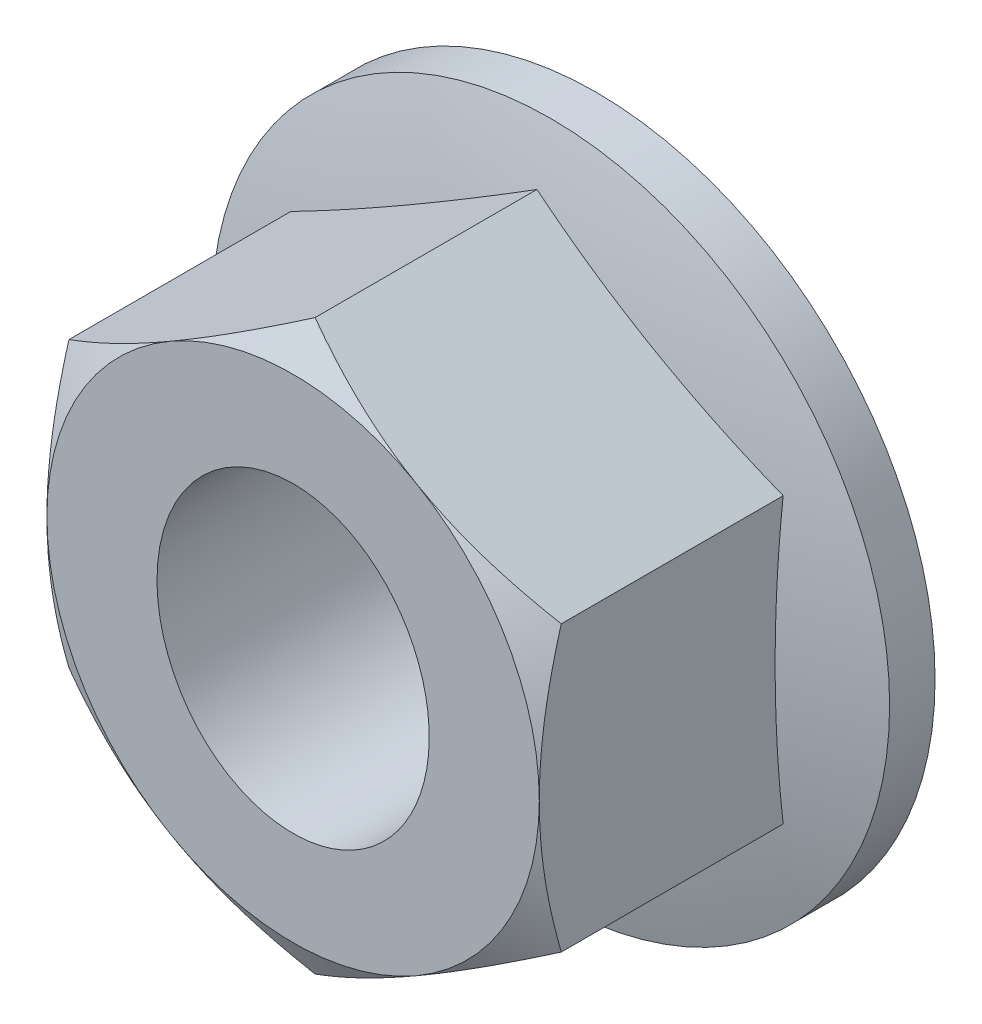
ISO-10303-21;
HEADER;
FILE_DESCRIPTION(('STEP AP214'),'2;1');
FILE_NAME('part.step','',(''),(''),'','','');
FILE_SCHEMA(('AUTOMOTIVE_DESIGN { 1 0 10303 214 1 1 1 1 }'));
ENDSEC;
DATA;
#1=APPLICATION_CONTEXT('core data for automotive mechanical design processes');
#2=APPLICATION_PROTOCOL_DEFINITION('international standard','automotive_design',2000,#1);
#3=PRODUCT_CONTEXT('',#1,'mechanical');
#4=PRODUCT('Part','Part','',(#3));
#5=PRODUCT_RELATED_PRODUCT_CATEGORY('part','',(#4));
#6=PRODUCT_DEFINITION_FORMATION('','',#4);
#7=PRODUCT_DEFINITION_CONTEXT('part definition',#1,'design');
#8=PRODUCT_DEFINITION('design','',#6,#7);
#9=PRODUCT_DEFINITION_SHAPE('','',#8);
#10=(LENGTH_UNIT() NAMED_UNIT(*) SI_UNIT(.MILLI.,.METRE.));
#11=(NAMED_UNIT(*) PLANE_ANGLE_UNIT() SI_UNIT($,.RADIAN.));
#12=(NAMED_UNIT(*) SI_UNIT($,.STERADIAN.) SOLID_ANGLE_UNIT());
#13=UNCERTAINTY_MEASURE_WITH_UNIT(LENGTH_MEASURE(1.E-05),#10,'distance_accuracy_value','');
#14=(GEOMETRIC_REPRESENTATION_CONTEXT(3) GLOBAL_UNCERTAINTY_ASSIGNED_CONTEXT((#13)) GLOBAL_UNIT_ASSIGNED_CONTEXT((#10,
#11,#12)) REPRESENTATION_CONTEXT('',''));
#15=CARTESIAN_POINT('',(0.,0.,0.));
#16=DIRECTION('',(0.,0.,1.));
#17=DIRECTION('',(1.,0.,0.));
#18=AXIS2_PLACEMENT_3D('',#15,#16,#17);
#19=CARTESIAN_POINT('',(6.5,-3.75277674973257,-4.));
#20=DIRECTION('',(0.,0.,1.));
#21=DIRECTION('',(1.,0.,0.));
#22=AXIS2_PLACEMENT_3D('',#19,#20,#21);
#23=PLANE('',#22);
#24=CARTESIAN_POINT('',(0.,0.,-4.));
#25=DIRECTION('',(0.,0.,-1.));
#26=DIRECTION('',(0.,1.,0.));
#27=AXIS2_PLACEMENT_3D('',#24,#25,#26);
#28=CIRCLE('',#27,8.95);
#29=CARTESIAN_POINT('',(0.,8.95,-4.));
#30=VERTEX_POINT('',#29);
#31=EDGE_CURVE('E233',#30,#30,#28,.T.);
#32=ORIENTED_EDGE('',*,*,#31,.T.);
#33=EDGE_LOOP('',(#32));
#34=FACE_BOUND('',#33,.T.);
#35=CARTESIAN_POINT('',(0.,0.,-4.));
#36=DIRECTION('',(0.,0.,1.));
#37=DIRECTION('',(0.,1.,0.));
#38=AXIS2_PLACEMENT_3D('',#35,#36,#37);
#39=ELLIPSE('',#38,4.,3.59405059197604);
#40=CARTESIAN_POINT('',(0.,4.,-4.));
#41=VERTEX_POINT('',#40);
#42=EDGE_CURVE('E132',#41,#41,#39,.F.);
#43=ORIENTED_EDGE('',*,*,#42,.F.);
#44=EDGE_LOOP('',(#43));
#45=FACE_BOUND('',#44,.T.);
#46=ADVANCED_FACE('F37',(#34,#45),#23,.F.);
#47=CARTESIAN_POINT('',(6.5,-3.75277674973257,4.));
#48=DIRECTION('',(0.,0.,1.));
#49=DIRECTION('',(1.,0.,0.));
#50=AXIS2_PLACEMENT_3D('',#47,#48,#49);
#51=PLANE('',#50);
#52=CARTESIAN_POINT('',(0.,0.,4.));
#53=DIRECTION('',(0.,0.,1.));
#54=DIRECTION('',(1.,0.,0.));
#55=AXIS2_PLACEMENT_3D('',#52,#53,#54);
#56=CIRCLE('',#55,6.5);
#57=CARTESIAN_POINT('',(3.25,-5.62916512459885,4.));
#58=VERTEX_POINT('',#57);
#59=CARTESIAN_POINT('',(6.5,0.,4.));
#60=VERTEX_POINT('',#59);
#61=EDGE_CURVE('E42',#58,#60,#56,.T.);
#62=ORIENTED_EDGE('',*,*,#61,.T.);
#63=CARTESIAN_POINT('',(0.,0.,4.));
#64=DIRECTION('',(0.,0.,1.));
#65=DIRECTION('',(1.,0.,0.));
#66=AXIS2_PLACEMENT_3D('',#63,#64,#65);
#67=CIRCLE('',#66,6.5);
#68=CARTESIAN_POINT('',(3.25,5.62916512459885,4.));
#69=VERTEX_POINT('',#68);
#70=EDGE_CURVE('E54',#60,#69,#67,.T.);
#71=ORIENTED_EDGE('',*,*,#70,.T.);
#72=CARTESIAN_POINT('',(-3.25,5.62916512459885,4.));
#73=VERTEX_POINT('',#72);
#74=EDGE_CURVE('E12',#69,#73,#56,.T.);
#75=ORIENTED_EDGE('',*,*,#74,.T.);
#76=CARTESIAN_POINT('',(-6.5,0.,4.));
#77=VERTEX_POINT('',#76);
#78=EDGE_CURVE('E47',#73,#77,#56,.T.);
#79=ORIENTED_EDGE('',*,*,#78,.T.);
#80=CARTESIAN_POINT('',(-3.25,-5.62916512459885,4.));
#81=VERTEX_POINT('',#80);
#82=EDGE_CURVE('E62',#77,#81,#56,.T.);
#83=ORIENTED_EDGE('',*,*,#82,.T.);
#84=EDGE_CURVE('E265',#81,#58,#56,.T.);
#85=ORIENTED_EDGE('',*,*,#84,.T.);
#86=EDGE_LOOP('',(#62,#71,#75,#79,#83,#85));
#87=FACE_BOUND('',#86,.T.);
#88=CARTESIAN_POINT('',(0.,0.,4.));
#89=DIRECTION('',(0.,0.,1.));
#90=DIRECTION('',(0.,1.,0.));
#91=AXIS2_PLACEMENT_3D('',#88,#89,#90);
#92=ELLIPSE('',#91,4.,3.59405059197604);
#93=CARTESIAN_POINT('',(0.,4.,4.));
#94=VERTEX_POINT('',#93);
#95=EDGE_CURVE('E397',#94,#94,#92,.T.);
#96=ORIENTED_EDGE('',*,*,#95,.F.);
#97=EDGE_LOOP('',(#96));
#98=FACE_BOUND('',#97,.T.);
#99=ADVANCED_FACE('F128',(#87,#98),#51,.T.);
#100=CARTESIAN_POINT('',(0.,-7.50555349946514,4.));
#101=DIRECTION('',(-0.5,0.866025403784439,0.));
#102=DIRECTION('',(-0.866025403784439,-0.5,0.));
#103=AXIS2_PLACEMENT_3D('',#100,#101,#102);
#104=PLANE('',#103);
#105=CARTESIAN_POINT('',(3.25,-5.62916512459885,-35.5760416666667));
#106=DIRECTION('',(-0.5,0.866025403784439,0.));
#107=DIRECTION('',(-0.866025403784439,-0.5,0.));
#108=AXIS2_PLACEMENT_3D('',#105,#106,#107);
#109=CIRCLE('',#108,33.3484843334007);
#110=CARTESIAN_POINT('',(0.,-7.50555349946513,-2.4393841103932));
#111=VERTEX_POINT('',#110);
#112=CARTESIAN_POINT('',(6.5,-3.75277674973257,-2.4393841103932));
#113=VERTEX_POINT('',#112);
#114=EDGE_CURVE('E245',#111,#113,#109,.T.);
#115=ORIENTED_EDGE('',*,*,#114,.T.);
#116=DIRECTION('',(0.,0.,-1.));
#117=VECTOR('',#116,1.);
#118=CARTESIAN_POINT('',(6.5,-3.75277674973257,4.));
#119=LINE('',#118,#117);
#120=CARTESIAN_POINT('',(6.5,-3.75277674973257,3.41944341639924));
#121=VERTEX_POINT('',#120);
#122=EDGE_CURVE('E259',#121,#113,#119,.T.);
#123=ORIENTED_EDGE('',*,*,#122,.F.);
#124=CARTESIAN_POINT('',(-0.000200000000000527,-7.50566896951897,3.41937674819413));
#125=CARTESIAN_POINT('',(0.14267745905888,-7.4231786300702,3.46699557692451));
#126=CARTESIAN_POINT('',(0.286087634534913,-7.34038072665458,3.51245329939729));
#127=CARTESIAN_POINT('',(0.574072631317194,-7.17411251123976,3.59845131797695));
#128=CARTESIAN_POINT('',(0.718647926571264,-7.09064192560665,3.63898949277197));
#129=CARTESIAN_POINT('',(1.15468865052003,-6.83889369625719,3.75242899887679));
#130=CARTESIAN_POINT('',(1.44787528284632,-6.66962231516081,3.81695219287126));
#131=CARTESIAN_POINT('',(1.88662374554438,-6.41631077211555,3.89261341645251));
#132=CARTESIAN_POINT('',(2.03087463649469,-6.33302748139454,3.91416714354301));
#133=CARTESIAN_POINT('',(2.32002821713809,-6.16608458377293,3.95030968539388));
#134=CARTESIAN_POINT('',(2.46493084809889,-6.08242501078143,3.96489911554033));
#135=CARTESIAN_POINT('',(2.75498777942832,-5.91496056339807,3.98674124749265));
#136=CARTESIAN_POINT('',(2.90014160605421,-5.8311559625217,3.99400227567789));
#137=CARTESIAN_POINT('',(3.19057533697495,-5.66347396979287,4.00103969741777));
#138=CARTESIAN_POINT('',(3.33585523723636,-5.5795965802691,4.00081632218779));
#139=CARTESIAN_POINT('',(3.7338759424265,-5.34979921898453,3.98991654148483));
#140=CARTESIAN_POINT('',(3.98648646102757,-5.20395446807007,3.97161818213058));
#141=CARTESIAN_POINT('',(4.49002967823568,-4.91323365606636,3.91359365854232));
#142=CARTESIAN_POINT('',(4.74096060593308,-4.76835861741226,3.87384766146175));
#143=CARTESIAN_POINT('',(5.24551722064432,-4.47705272008732,3.77449409679785));
#144=CARTESIAN_POINT('',(5.49907924143591,-4.33065861912703,3.71446557436197));
#145=CARTESIAN_POINT('',(6.00242193575905,-4.04005357906494,3.57822500749013));
#146=CARTESIAN_POINT('',(6.25220905555296,-3.89583891821182,3.50204496583641));
#147=CARTESIAN_POINT('',(6.5002,-3.75266127967873,3.41937674819413));
#148=B_SPLINE_CURVE_WITH_KNOTS('',3,(#124,#125,#126,#127,#128,#129,#130,#131,#132,#133,#134,
#135,#136,#137,#138,#139,#140,#141,#142,#143,#144,#145,#146,#147),.UNSPECIFIED.,.F.,.F.,(4,2,2,
2,2,2,2,2,2,2,2,4),(0.,0.515105052395588,1.03043143507524,2.06322554824262,2.56697389547996,
3.07067772176454,3.57380860368928,4.0769239424252,4.9527935470566,5.82947446853466,
6.72559912449736,7.61996451221045),.UNSPECIFIED.);
#149=EDGE_CURVE('E173',#58,#121,#148,.T.);
#150=ORIENTED_EDGE('',*,*,#149,.F.);
#151=CARTESIAN_POINT('',(0.,-7.50555349946514,3.41944341639924));
#152=VERTEX_POINT('',#151);
#153=EDGE_CURVE('E238',#152,#58,#148,.T.);
#154=ORIENTED_EDGE('',*,*,#153,.F.);
#155=DIRECTION('',(0.,0.,-1.));
#156=VECTOR('',#155,1.);
#157=CARTESIAN_POINT('',(0.,-7.50555349946514,4.));
#158=LINE('',#157,#156);
#159=EDGE_CURVE('E247',#152,#111,#158,.T.);
#160=ORIENTED_EDGE('',*,*,#159,.T.);
#161=EDGE_LOOP('',(#115,#123,#150,#154,#160));
#162=FACE_BOUND('',#161,.T.);
#163=ADVANCED_FACE('F39',(#162),#104,.F.);
#164=CARTESIAN_POINT('',(6.5,-3.75277674973257,4.));
#165=DIRECTION('',(-1.,0.,0.));
#166=DIRECTION('',(0.,0.,1.));
#167=AXIS2_PLACEMENT_3D('',#164,#165,#166);
#168=PLANE('',#167);
#169=CARTESIAN_POINT('',(6.5,0.,-35.5760416666667));
#170=DIRECTION('',(-1.,0.,0.));
#171=DIRECTION('',(0.,0.,1.));
#172=AXIS2_PLACEMENT_3D('',#169,#170,#171);
#173=CIRCLE('',#172,33.3484843334007);
#174=CARTESIAN_POINT('',(6.5,3.75277674973257,-2.4393841103932));
#175=VERTEX_POINT('',#174);
#176=EDGE_CURVE('E243',#113,#175,#173,.T.);
#177=ORIENTED_EDGE('',*,*,#176,.T.);
#178=DIRECTION('',(0.,0.,-1.));
#179=VECTOR('',#178,1.);
#180=CARTESIAN_POINT('',(6.5,3.75277674973257,4.));
#181=LINE('',#180,#179);
#182=CARTESIAN_POINT('',(6.5,3.75277674973257,3.41944341639924));
#183=VERTEX_POINT('',#182);
#184=EDGE_CURVE('E257',#183,#175,#181,.T.);
#185=ORIENTED_EDGE('',*,*,#184,.F.);
#186=CARTESIAN_POINT('',(6.5,-10.0963919715275,0.820073312575115));
#187=CARTESIAN_POINT('',(6.5,-9.81227513990349,0.957959586404299));
#188=CARTESIAN_POINT('',(6.5,-9.52750762798788,1.09452802035306));
#189=CARTESIAN_POINT('',(6.5,-8.95632511409539,1.36428804932137));
#190=CARTESIAN_POINT('',(6.5,-8.66990986216311,1.49747911450028));
#191=CARTESIAN_POINT('',(6.5,-8.09361871339851,1.76040943374929));
#192=CARTESIAN_POINT('',(6.5,-7.80373247633217,1.89012610204594));
#193=CARTESIAN_POINT('',(6.5,-7.22165890017113,2.1442695654699));
#194=CARTESIAN_POINT('',(6.5,-6.92947167031463,2.26869660994574));
#195=CARTESIAN_POINT('',(6.5,-6.33301531115799,2.51470665844866));
#196=CARTESIAN_POINT('',(6.5,-6.02865688470582,2.63607433263686));
#197=CARTESIAN_POINT('',(6.5,-5.41638541636121,2.86966261405783));
#198=CARTESIAN_POINT('',(6.5,-5.10847198113856,2.98188219784603));
#199=CARTESIAN_POINT('',(6.5,-4.48917209178903,3.19424167424716));
#200=CARTESIAN_POINT('',(6.5,-4.1777940419404,3.29440583551461));
#201=CARTESIAN_POINT('',(6.5,-3.55056915218889,3.47945066170987));
#202=CARTESIAN_POINT('',(6.5,-3.23472374727588,3.56433611933384));
#203=CARTESIAN_POINT('',(6.5,-2.60006610016486,3.71433523445441));
#204=CARTESIAN_POINT('',(6.5,-2.28127845327809,3.77955129499948));
#205=CARTESIAN_POINT('',(6.5,-1.63967890067641,3.88648890188148));
#206=CARTESIAN_POINT('',(6.5,-1.31686741102162,3.92821285700891));
#207=CARTESIAN_POINT('',(6.5,-0.833063242366681,3.97041028941199));
#208=CARTESIAN_POINT('',(6.5,-0.672919409436065,3.98107320533935));
#209=CARTESIAN_POINT('',(6.5,-0.352317218488285,3.99562225451347));
#210=CARTESIAN_POINT('',(6.5,-0.191858865768644,3.99950850093572));
#211=CARTESIAN_POINT('',(6.5,0.129079171757187,4.00040398016401));
#212=CARTESIAN_POINT('',(6.5,0.289558856901235,3.99741308657789));
#213=CARTESIAN_POINT('',(6.5,0.610249570758745,3.98462937070954));
#214=CARTESIAN_POINT('',(6.5,0.770460585777281,3.97483621166222));
#215=CARTESIAN_POINT('',(6.5,1.15486934266527,3.94338473283719));
#216=CARTESIAN_POINT('',(6.5,1.37881136595179,3.91853387128115));
#217=CARTESIAN_POINT('',(6.5,1.82503456000491,3.85689180041915));
#218=CARTESIAN_POINT('',(6.5,2.04731550421968,3.82009899171582));
#219=CARTESIAN_POINT('',(6.5,2.71139886760964,3.69375887088698));
#220=CARTESIAN_POINT('',(6.5,3.15020885624346,3.58827144570438));
#221=CARTESIAN_POINT('',(6.5,3.80665467470945,3.40525984781085));
#222=CARTESIAN_POINT('',(6.5,4.02768844084769,3.33922350883576));
#223=CARTESIAN_POINT('',(6.5,4.46760772294329,3.20028186618112));
#224=CARTESIAN_POINT('',(6.5,4.68649322233623,3.12737650958324));
#225=CARTESIAN_POINT('',(6.5,5.12218921630136,2.97586785527711));
#226=CARTESIAN_POINT('',(6.5,5.33900033060887,2.89726632358981));
#227=CARTESIAN_POINT('',(6.5,5.77082103706071,2.73529150054992));
#228=CARTESIAN_POINT('',(6.5,5.98583067252543,2.65191832432144));
#229=CARTESIAN_POINT('',(6.5,6.57762346747399,2.41610344459766));
#230=CARTESIAN_POINT('',(6.5,6.95273709218871,2.25947553475083));
#231=CARTESIAN_POINT('',(6.5,7.69906360084413,1.93715429690033));
#232=CARTESIAN_POINT('',(6.5,8.0702760309583,1.77145992780981));
#233=CARTESIAN_POINT('',(6.5,8.80973117789406,1.43321767619598));
#234=CARTESIAN_POINT('',(6.5,9.17797267095829,1.26066712722131));
#235=CARTESIAN_POINT('',(6.5,9.91196241134617,0.910399487451304));
#236=CARTESIAN_POINT('',(6.5,10.2777107644285,0.73268261751562));
#237=CARTESIAN_POINT('',(6.5,11.0078145646525,0.372945088975421));
#238=CARTESIAN_POINT('',(6.5,11.372166810087,0.190917945871546));
#239=CARTESIAN_POINT('',(6.5,12.0992690914378,-0.17631130018376));
#240=CARTESIAN_POINT('',(6.5,12.4620191132118,-0.361513431089628));
#241=CARTESIAN_POINT('',(6.5,13.1861284056812,-0.734413637323354));
#242=CARTESIAN_POINT('',(6.5,13.5474879730383,-0.922111137258033));
#243=CARTESIAN_POINT('',(6.5,14.2691297684936,-1.29956698187999));
#244=CARTESIAN_POINT('',(6.5,14.6294119925662,-1.48932533425545));
#245=CARTESIAN_POINT('',(6.5,15.6304440889793,-2.01955528759972));
#246=CARTESIAN_POINT('',(6.5,16.2702246732199,-2.36185640406188));
#247=CARTESIAN_POINT('',(6.5,17.5477484862382,-3.05032825209602));
#248=CARTESIAN_POINT('',(6.5,18.1854915826276,-3.39649922879684));
#249=CARTESIAN_POINT('',(6.5,19.4573077941454,-4.09055728550746));
#250=CARTESIAN_POINT('',(6.5,20.0913860725359,-4.43843491298483));
#251=CARTESIAN_POINT('',(6.5,21.358272715763,-5.13637717161847));
#252=CARTESIAN_POINT('',(6.5,21.9910811774059,-5.48644162698597));
#253=CARTESIAN_POINT('',(6.5,22.623447348559,-5.83729769123375));
#254=B_SPLINE_CURVE_WITH_KNOTS('',3,(#186,#187,#188,#189,#190,#191,#192,#193,#194,#195,#196,
#197,#198,#199,#200,#201,#202,#203,#204,#205,#206,#207,#208,#209,#210,#211,#212,#213,#214,#215,
#216,#217,#218,#219,#220,#221,#222,#223,#224,#225,#226,#227,#228,#229,#230,#231,#232,#233,#234,
#235,#236,#237,#238,#239,#240,#241,#242,#243,#244,#245,#246,#247,#248,#249,#250,#251,#252,#253),
.UNSPECIFIED.,.F.,.F.,(4,2,2,2,2,2,2,2,2,2,2,2,2,2,2,2,2,2,2,2,2,2,2,2,2,2,2,2,2,2,2,2,2,4),(0.,
0.947436970356855,1.89502166613963,2.8477353563257,3.80040408645761,4.78328468623342,
5.76627509550996,6.74725232942827,7.72792130743148,8.7033928988457,9.67876445091546,
10.1601381370265,10.6415037837566,11.1228782773804,11.6042766044876,12.2798457588643,
12.9555054302793,14.3075235006305,14.9995277783266,15.6915373876009,16.3833333591755,
17.0751126470188,18.2944315251771,19.5138907107782,20.7338288920711,21.9537149976133,
23.1755703709091,24.3974365076597,25.619025626279,26.8406193037105,29.017385971545,
31.1942913126787,33.3640022117562,35.5335408865492),.UNSPECIFIED.);
#255=EDGE_CURVE('E114',#60,#183,#254,.T.);
#256=ORIENTED_EDGE('',*,*,#255,.F.);
#257=EDGE_CURVE('E280',#121,#60,#254,.T.);
#258=ORIENTED_EDGE('',*,*,#257,.F.);
#259=ORIENTED_EDGE('',*,*,#122,.T.);
#260=EDGE_LOOP('',(#177,#185,#256,#258,#259));
#261=FACE_BOUND('',#260,.T.);
#262=ADVANCED_FACE('F210',(#261),#168,.F.);
#263=CARTESIAN_POINT('',(6.5,3.75277674973257,4.));
#264=DIRECTION('',(-0.5,-0.866025403784439,0.));
#265=DIRECTION('',(0.866025403784439,-0.5,0.));
#266=AXIS2_PLACEMENT_3D('',#263,#264,#265);
#267=PLANE('',#266);
#268=CARTESIAN_POINT('',(3.25,5.62916512459885,-35.5760416666667));
#269=DIRECTION('',(-0.5,-0.866025403784439,0.));
#270=DIRECTION('',(0.866025403784439,-0.5,0.));
#271=AXIS2_PLACEMENT_3D('',#268,#269,#270);
#272=CIRCLE('',#271,33.3484843334007);
#273=CARTESIAN_POINT('',(0.,7.50555349946513,-2.4393841103932));
#274=VERTEX_POINT('',#273);
#275=EDGE_CURVE('E241',#175,#274,#272,.T.);
#276=ORIENTED_EDGE('',*,*,#275,.T.);
#277=DIRECTION('',(0.,0.,-1.));
#278=VECTOR('',#277,1.);
#279=CARTESIAN_POINT('',(0.,7.50555349946513,4.));
#280=LINE('',#279,#278);
#281=CARTESIAN_POINT('',(0.,7.50555349946513,3.41944341639924));
#282=VERTEX_POINT('',#281);
#283=EDGE_CURVE('E137',#282,#274,#280,.T.);
#284=ORIENTED_EDGE('',*,*,#283,.F.);
#285=CARTESIAN_POINT('',(6.5002,3.75266127967873,3.41937674819413));
#286=CARTESIAN_POINT('',(6.35732254094112,3.8351516191275,3.46699557692451));
#287=CARTESIAN_POINT('',(6.21391236546509,3.91794952254312,3.51245329939729));
#288=CARTESIAN_POINT('',(5.9259273686828,4.08421773795795,3.59845131797695));
#289=CARTESIAN_POINT('',(5.78135207342873,4.16768832359105,3.63898949277197));
#290=CARTESIAN_POINT('',(5.34531134947996,4.41943655294051,3.75242899887679));
#291=CARTESIAN_POINT('',(5.05212471715368,4.5887079340369,3.81695219287126));
#292=CARTESIAN_POINT('',(4.61337625445563,4.84201947708215,3.89261341645251));
#293=CARTESIAN_POINT('',(4.46912536350531,4.92530276780316,3.91416714354301));
#294=CARTESIAN_POINT('',(4.17997178286191,5.09224566542477,3.95030968539388));
#295=CARTESIAN_POINT('',(4.03506915190111,5.17590523841627,3.96489911554033));
#296=CARTESIAN_POINT('',(3.74501222057168,5.34336968579964,3.98674124749265));
#297=CARTESIAN_POINT('',(3.59985839394579,5.427174286676,3.99400227567789));
#298=CARTESIAN_POINT('',(3.30942466302505,5.59485627940484,4.00103969741777));
#299=CARTESIAN_POINT('',(3.16414476276364,5.6787336689286,4.0008163221878));
#300=CARTESIAN_POINT('',(2.76612405757351,5.90853103021317,3.98991654148483));
#301=CARTESIAN_POINT('',(2.51351353897243,6.05437578112763,3.97161818213059));
#302=CARTESIAN_POINT('',(2.00997032176432,6.34509659313135,3.91359365854232));
#303=CARTESIAN_POINT('',(1.75903939406692,6.48997163178544,3.87384766146175));
#304=CARTESIAN_POINT('',(1.25448277935568,6.78127752911038,3.77449409679785));
#305=CARTESIAN_POINT('',(1.00092075856409,6.92767163007067,3.71446557436197));
#306=CARTESIAN_POINT('',(0.497578064240955,7.21827667013277,3.57822500749013));
#307=CARTESIAN_POINT('',(0.247790944447036,7.36249133098589,3.50204496583641));
#308=CARTESIAN_POINT('',(-0.000199999999999324,7.50566896951897,3.41937674819413));
#309=B_SPLINE_CURVE_WITH_KNOTS('',3,(#285,#286,#287,#288,#289,#290,#291,#292,#293,#294,#295,
#296,#297,#298,#299,#300,#301,#302,#303,#304,#305,#306,#307,#308),.UNSPECIFIED.,.F.,.F.,(4,2,2,
2,2,2,2,2,2,2,2,4),(0.,0.515105052395587,1.03043143507524,2.06322554824262,2.56697389547996,
3.07067772176454,3.57380860368928,4.0769239424252,4.9527935470566,5.82947446853466,
6.72559912449736,7.61996451221045),.UNSPECIFIED.);
#310=EDGE_CURVE('E119',#69,#282,#309,.T.);
#311=ORIENTED_EDGE('',*,*,#310,.F.);
#312=EDGE_CURVE('E110',#183,#69,#309,.T.);
#313=ORIENTED_EDGE('',*,*,#312,.F.);
#314=ORIENTED_EDGE('',*,*,#184,.T.);
#315=EDGE_LOOP('',(#276,#284,#311,#313,#314));
#316=FACE_BOUND('',#315,.T.);
#317=ADVANCED_FACE('F135',(#316),#267,.F.);
#318=CARTESIAN_POINT('',(0.,7.50555349946513,4.));
#319=DIRECTION('',(0.5,-0.866025403784439,0.));
#320=DIRECTION('',(0.866025403784439,0.5,0.));
#321=AXIS2_PLACEMENT_3D('',#318,#319,#320);
#322=PLANE('',#321);
#323=CARTESIAN_POINT('',(-3.25,5.62916512459885,-35.5760416666667));
#324=DIRECTION('',(0.5,-0.866025403784439,0.));
#325=DIRECTION('',(0.866025403784439,0.5,0.));
#326=AXIS2_PLACEMENT_3D('',#323,#324,#325);
#327=CIRCLE('',#326,33.3484843334007);
#328=CARTESIAN_POINT('',(-6.5,3.75277674973257,-2.4393841103932));
#329=VERTEX_POINT('',#328);
#330=EDGE_CURVE('E236',#274,#329,#327,.T.);
#331=ORIENTED_EDGE('',*,*,#330,.T.);
#332=DIRECTION('',(0.,0.,-1.));
#333=VECTOR('',#332,1.);
#334=CARTESIAN_POINT('',(-6.5,3.75277674973257,4.));
#335=LINE('',#334,#333);
#336=CARTESIAN_POINT('',(-6.5,3.75277674973257,3.41944341639924));
#337=VERTEX_POINT('',#336);
#338=EDGE_CURVE('E253',#337,#329,#335,.T.);
#339=ORIENTED_EDGE('',*,*,#338,.F.);
#340=CARTESIAN_POINT('',(0.000200000000000299,7.50566896951897,3.41937674819413));
#341=CARTESIAN_POINT('',(-0.14267745905888,7.4231786300702,3.46699557692451));
#342=CARTESIAN_POINT('',(-0.286087634534912,7.34038072665458,3.51245329939729));
#343=CARTESIAN_POINT('',(-0.574072631317194,7.17411251123976,3.59845131797695));
#344=CARTESIAN_POINT('',(-0.718647926571263,7.09064192560665,3.63898949277197));
#345=CARTESIAN_POINT('',(-1.15468865052003,6.83889369625719,3.75242899887679));
#346=CARTESIAN_POINT('',(-1.44787528284632,6.66962231516081,3.81695219287126));
#347=CARTESIAN_POINT('',(-1.88662374554437,6.41631077211555,3.89261341645251));
#348=CARTESIAN_POINT('',(-2.03087463649469,6.33302748139454,3.91416714354301));
#349=CARTESIAN_POINT('',(-2.32002821713809,6.16608458377293,3.95030968539388));
#350=CARTESIAN_POINT('',(-2.46493084809889,6.08242501078143,3.96489911554033));
#351=CARTESIAN_POINT('',(-2.75498777942832,5.91496056339806,3.98674124749265));
#352=CARTESIAN_POINT('',(-2.90014160605421,5.8311559625217,3.99400227567789));
#353=CARTESIAN_POINT('',(-3.19057533697495,5.66347396979287,4.00103969741777));
#354=CARTESIAN_POINT('',(-3.33585523723636,5.5795965802691,4.0008163221878));
#355=CARTESIAN_POINT('',(-3.73387594242649,5.34979921898453,3.98991654148483));
#356=CARTESIAN_POINT('',(-3.98648646102757,5.20395446807007,3.97161818213059));
#357=CARTESIAN_POINT('',(-4.49002967823568,4.91323365606636,3.91359365854232));
#358=CARTESIAN_POINT('',(-4.74096060593308,4.76835861741226,3.87384766146175));
#359=CARTESIAN_POINT('',(-5.24551722064432,4.47705272008732,3.77449409679785));
#360=CARTESIAN_POINT('',(-5.49907924143591,4.33065861912703,3.71446557436197));
#361=CARTESIAN_POINT('',(-6.00242193575904,4.04005357906494,3.57822500749013));
#362=CARTESIAN_POINT('',(-6.25220905555296,3.89583891821182,3.50204496583641));
#363=CARTESIAN_POINT('',(-6.5002,3.75266127967873,3.41937674819413));
#364=B_SPLINE_CURVE_WITH_KNOTS('',3,(#340,#341,#342,#343,#344,#345,#346,#347,#348,#349,#350,
#351,#352,#353,#354,#355,#356,#357,#358,#359,#360,#361,#362,#363),.UNSPECIFIED.,.F.,.F.,(4,2,2,
2,2,2,2,2,2,2,2,4),(0.,0.515105052395587,1.03043143507524,2.06322554824262,2.56697389547996,
3.07067772176454,3.57380860368928,4.0769239424252,4.9527935470566,5.82947446853466,
6.72559912449736,7.61996451221045),.UNSPECIFIED.);
#365=EDGE_CURVE('E138',#73,#337,#364,.T.);
#366=ORIENTED_EDGE('',*,*,#365,.F.);
#367=EDGE_CURVE('E124',#282,#73,#364,.T.);
#368=ORIENTED_EDGE('',*,*,#367,.F.);
#369=ORIENTED_EDGE('',*,*,#283,.T.);
#370=EDGE_LOOP('',(#331,#339,#366,#368,#369));
#371=FACE_BOUND('',#370,.T.);
#372=ADVANCED_FACE('F200',(#371),#322,.F.);
#373=CARTESIAN_POINT('',(-6.5,3.75277674973257,4.));
#374=DIRECTION('',(1.,0.,0.));
#375=DIRECTION('',(0.,0.,-1.));
#376=AXIS2_PLACEMENT_3D('',#373,#374,#375);
#377=PLANE('',#376);
#378=CARTESIAN_POINT('',(-6.5,0.,-35.5760416666667));
#379=DIRECTION('',(1.,0.,0.));
#380=DIRECTION('',(0.,0.,-1.));
#381=AXIS2_PLACEMENT_3D('',#378,#379,#380);
#382=CIRCLE('',#381,33.3484843334007);
#383=CARTESIAN_POINT('',(-6.5,-3.75277674973257,-2.4393841103932));
#384=VERTEX_POINT('',#383);
#385=EDGE_CURVE('E234',#329,#384,#382,.T.);
#386=ORIENTED_EDGE('',*,*,#385,.T.);
#387=DIRECTION('',(0.,0.,-1.));
#388=VECTOR('',#387,1.);
#389=CARTESIAN_POINT('',(-6.5,-3.75277674973257,4.));
#390=LINE('',#389,#388);
#391=CARTESIAN_POINT('',(-6.5,-3.75277674973257,3.41944341639924));
#392=VERTEX_POINT('',#391);
#393=EDGE_CURVE('E250',#392,#384,#390,.T.);
#394=ORIENTED_EDGE('',*,*,#393,.F.);
#395=CARTESIAN_POINT('',(-6.5,-10.0963919715275,0.820073312575118));
#396=CARTESIAN_POINT('',(-6.5,-9.81227513990348,0.957959586404303));
#397=CARTESIAN_POINT('',(-6.5,-9.52750762798788,1.09452802035306));
#398=CARTESIAN_POINT('',(-6.5,-8.95632511409539,1.36428804932138));
#399=CARTESIAN_POINT('',(-6.5,-8.6699098621631,1.49747911450028));
#400=CARTESIAN_POINT('',(-6.5,-8.09361871339851,1.76040943374929));
#401=CARTESIAN_POINT('',(-6.5,-7.80373247633217,1.89012610204594));
#402=CARTESIAN_POINT('',(-6.5,-7.22165890017112,2.1442695654699));
#403=CARTESIAN_POINT('',(-6.5,-6.92947167031463,2.26869660994574));
#404=CARTESIAN_POINT('',(-6.5,-6.33301531115799,2.51470665844866));
#405=CARTESIAN_POINT('',(-6.5,-6.02865688470582,2.63607433263686));
#406=CARTESIAN_POINT('',(-6.5,-5.41638541636121,2.86966261405783));
#407=CARTESIAN_POINT('',(-6.5,-5.10847198113856,2.98188219784603));
#408=CARTESIAN_POINT('',(-6.5,-4.48917209178903,3.19424167424717));
#409=CARTESIAN_POINT('',(-6.5,-4.1777940419404,3.29440583551461));
#410=CARTESIAN_POINT('',(-6.5,-3.55056915218888,3.47945066170987));
#411=CARTESIAN_POINT('',(-6.5,-3.23472374727588,3.56433611933384));
#412=CARTESIAN_POINT('',(-6.5,-2.60006610016486,3.71433523445441));
#413=CARTESIAN_POINT('',(-6.5,-2.28127845327808,3.77955129499948));
#414=CARTESIAN_POINT('',(-6.5,-1.6396789006764,3.88648890188148));
#415=CARTESIAN_POINT('',(-6.5,-1.31686741102162,3.92821285700891));
#416=CARTESIAN_POINT('',(-6.5,-0.833063242366679,3.97041028941199));
#417=CARTESIAN_POINT('',(-6.5,-0.672919409436063,3.98107320533935));
#418=CARTESIAN_POINT('',(-6.5,-0.352317218488283,3.99562225451347));
#419=CARTESIAN_POINT('',(-6.5,-0.191858865768642,3.99950850093572));
#420=CARTESIAN_POINT('',(-6.5,0.129079171757189,4.00040398016401));
#421=CARTESIAN_POINT('',(-6.5,0.289558856901237,3.99741308657789));
#422=CARTESIAN_POINT('',(-6.5,0.610249570758748,3.98462937070954));
#423=CARTESIAN_POINT('',(-6.5,0.770460585777283,3.97483621166222));
#424=CARTESIAN_POINT('',(-6.5,1.15486934266527,3.94338473283719));
#425=CARTESIAN_POINT('',(-6.5,1.37881136595179,3.91853387128115));
#426=CARTESIAN_POINT('',(-6.5,1.82503456000492,3.85689180041914));
#427=CARTESIAN_POINT('',(-6.5,2.04731550421968,3.82009899171582));
#428=CARTESIAN_POINT('',(-6.5,2.71139886760965,3.69375887088698));
#429=CARTESIAN_POINT('',(-6.5,3.15020885624346,3.58827144570438));
#430=CARTESIAN_POINT('',(-6.5,3.80665467470945,3.40525984781085));
#431=CARTESIAN_POINT('',(-6.5,4.0276884408477,3.33922350883576));
#432=CARTESIAN_POINT('',(-6.5,4.4676077229433,3.20028186618112));
#433=CARTESIAN_POINT('',(-6.5,4.68649322233623,3.12737650958324));
#434=CARTESIAN_POINT('',(-6.5,5.12218921630136,2.97586785527711));
#435=CARTESIAN_POINT('',(-6.5,5.33900033060887,2.8972663235898));
#436=CARTESIAN_POINT('',(-6.5,5.77082103706071,2.73529150054992));
#437=CARTESIAN_POINT('',(-6.5,5.98583067252543,2.65191832432144));
#438=CARTESIAN_POINT('',(-6.5,6.57762346747399,2.41610344459766));
#439=CARTESIAN_POINT('',(-6.5,6.95273709218871,2.25947553475083));
#440=CARTESIAN_POINT('',(-6.5,7.69906360084413,1.93715429690033));
#441=CARTESIAN_POINT('',(-6.5,8.0702760309583,1.7714599278098));
#442=CARTESIAN_POINT('',(-6.5,8.80973117789407,1.43321767619597));
#443=CARTESIAN_POINT('',(-6.5,9.1779726709583,1.2606671272213));
#444=CARTESIAN_POINT('',(-6.5,9.91196241134618,0.910399487451302));
#445=CARTESIAN_POINT('',(-6.5,10.2777107644285,0.732682617515617));
#446=CARTESIAN_POINT('',(-6.5,11.0078145646525,0.372945088975417));
#447=CARTESIAN_POINT('',(-6.5,11.372166810087,0.190917945871542));
#448=CARTESIAN_POINT('',(-6.5,12.0992690914378,-0.176311300183762));
#449=CARTESIAN_POINT('',(-6.5,12.4620191132118,-0.361513431089629));
#450=CARTESIAN_POINT('',(-6.5,13.1861284056812,-0.734413637323355));
#451=CARTESIAN_POINT('',(-6.5,13.5474879730383,-0.922111137258036));
#452=CARTESIAN_POINT('',(-6.5,14.2691297684936,-1.29956698187999));
#453=CARTESIAN_POINT('',(-6.5,14.6294119925662,-1.48932533425546));
#454=CARTESIAN_POINT('',(-6.5,15.6304440889793,-2.01955528759972));
#455=CARTESIAN_POINT('',(-6.5,16.2702246732199,-2.36185640406188));
#456=CARTESIAN_POINT('',(-6.5,17.5477484862382,-3.05032825209602));
#457=CARTESIAN_POINT('',(-6.5,18.1854915826276,-3.39649922879684));
#458=CARTESIAN_POINT('',(-6.5,19.4573077941454,-4.09055728550746));
#459=CARTESIAN_POINT('',(-6.5,20.0913860725359,-4.43843491298483));
#460=CARTESIAN_POINT('',(-6.5,21.358272715763,-5.13637717161848));
#461=CARTESIAN_POINT('',(-6.5,21.9910811774059,-5.48644162698597));
#462=CARTESIAN_POINT('',(-6.5,22.623447348559,-5.83729769123375));
#463=B_SPLINE_CURVE_WITH_KNOTS('',3,(#395,#396,#397,#398,#399,#400,#401,#402,#403,#404,#405,
#406,#407,#408,#409,#410,#411,#412,#413,#414,#415,#416,#417,#418,#419,#420,#421,#422,#423,#424,
#425,#426,#427,#428,#429,#430,#431,#432,#433,#434,#435,#436,#437,#438,#439,#440,#441,#442,#443,
#444,#445,#446,#447,#448,#449,#450,#451,#452,#453,#454,#455,#456,#457,#458,#459,#460,#461,#462),
.UNSPECIFIED.,.F.,.F.,(4,2,2,2,2,2,2,2,2,2,2,2,2,2,2,2,2,2,2,2,2,2,2,2,2,2,2,2,2,2,2,2,2,4),(0.,
0.947436970356853,1.89502166613962,2.8477353563257,3.80040408645761,4.78328468623341,
5.76627509550996,6.74725232942827,7.72792130743147,8.70339289884569,9.67876445091545,
10.1601381370264,10.6415037837566,11.1228782773804,11.6042766044876,12.2798457588643,
12.9555054302793,14.3075235006305,14.9995277783266,15.6915373876009,16.3833333591754,
17.0751126470188,18.2944315251771,19.5138907107782,20.7338288920711,21.9537149976133,
23.1755703709091,24.3974365076597,25.619025626279,26.8406193037105,29.017385971545,
31.1942913126787,33.3640022117561,35.5335408865492),.UNSPECIFIED.);
#464=EDGE_CURVE('E188',#77,#392,#463,.F.);
#465=ORIENTED_EDGE('',*,*,#464,.F.);
#466=EDGE_CURVE('E194',#337,#77,#463,.F.);
#467=ORIENTED_EDGE('',*,*,#466,.F.);
#468=ORIENTED_EDGE('',*,*,#338,.T.);
#469=EDGE_LOOP('',(#386,#394,#465,#467,#468));
#470=FACE_BOUND('',#469,.T.);
#471=ADVANCED_FACE('F196',(#470),#377,.F.);
#472=CARTESIAN_POINT('',(-6.5,-3.75277674973257,4.));
#473=DIRECTION('',(0.5,0.866025403784438,0.));
#474=DIRECTION('',(-0.866025403784439,0.5,0.));
#475=AXIS2_PLACEMENT_3D('',#472,#473,#474);
#476=PLANE('',#475);
#477=CARTESIAN_POINT('',(-3.25,-5.62916512459885,-35.5760416666667));
#478=DIRECTION('',(0.5,0.866025403784438,0.));
#479=DIRECTION('',(-0.866025403784439,0.5,0.));
#480=AXIS2_PLACEMENT_3D('',#477,#478,#479);
#481=CIRCLE('',#480,33.3484843334007);
#482=EDGE_CURVE('E261',#384,#111,#481,.T.);
#483=ORIENTED_EDGE('',*,*,#482,.T.);
#484=ORIENTED_EDGE('',*,*,#159,.F.);
#485=CARTESIAN_POINT('',(-6.5002,-3.75266127967873,3.41937674819413));
#486=CARTESIAN_POINT('',(-6.35732254094112,-3.8351516191275,3.46699557692451));
#487=CARTESIAN_POINT('',(-6.21391236546509,-3.91794952254312,3.51245329939729));
#488=CARTESIAN_POINT('',(-5.9259273686828,-4.08421773795795,3.59845131797695));
#489=CARTESIAN_POINT('',(-5.78135207342873,-4.16768832359105,3.63898949277197));
#490=CARTESIAN_POINT('',(-5.34531134947996,-4.41943655294051,3.75242899887679));
#491=CARTESIAN_POINT('',(-5.05212471715368,-4.5887079340369,3.81695219287126));
#492=CARTESIAN_POINT('',(-4.61337625445563,-4.84201947708215,3.89261341645251));
#493=CARTESIAN_POINT('',(-4.46912536350531,-4.92530276780316,3.91416714354301));
#494=CARTESIAN_POINT('',(-4.17997178286191,-5.09224566542477,3.95030968539388));
#495=CARTESIAN_POINT('',(-4.03506915190111,-5.17590523841627,3.96489911554033));
#496=CARTESIAN_POINT('',(-3.74501222057168,-5.34336968579964,3.98674124749265));
#497=CARTESIAN_POINT('',(-3.59985839394579,-5.427174286676,3.99400227567789));
#498=CARTESIAN_POINT('',(-3.30942466302505,-5.59485627940484,4.00103969741777));
#499=CARTESIAN_POINT('',(-3.16414476276364,-5.6787336689286,4.0008163221878));
#500=CARTESIAN_POINT('',(-2.76612405757351,-5.90853103021317,3.98991654148483));
#501=CARTESIAN_POINT('',(-2.51351353897243,-6.05437578112763,3.97161818213059));
#502=CARTESIAN_POINT('',(-2.00997032176432,-6.34509659313135,3.91359365854232));
#503=CARTESIAN_POINT('',(-1.75903939406692,-6.48997163178545,3.87384766146175));
#504=CARTESIAN_POINT('',(-1.25448277935568,-6.78127752911039,3.77449409679785));
#505=CARTESIAN_POINT('',(-1.00092075856409,-6.92767163007068,3.71446557436197));
#506=CARTESIAN_POINT('',(-0.497578064240955,-7.21827667013277,3.57822500749013));
#507=CARTESIAN_POINT('',(-0.247790944447036,-7.36249133098589,3.5020449658364));
#508=CARTESIAN_POINT('',(0.000200000000000102,-7.50566896951897,3.41937674819413));
#509=B_SPLINE_CURVE_WITH_KNOTS('',3,(#485,#486,#487,#488,#489,#490,#491,#492,#493,#494,#495,
#496,#497,#498,#499,#500,#501,#502,#503,#504,#505,#506,#507,#508),.UNSPECIFIED.,.F.,.F.,(4,2,2,
2,2,2,2,2,2,2,2,4),(0.,0.515105052395587,1.03043143507525,2.06322554824262,2.56697389547996,
3.07067772176454,3.57380860368928,4.0769239424252,4.9527935470566,5.82947446853466,
6.72559912449736,7.61996451221046),.UNSPECIFIED.);
#510=EDGE_CURVE('E131',#81,#152,#509,.T.);
#511=ORIENTED_EDGE('',*,*,#510,.F.);
#512=EDGE_CURVE('E195',#392,#81,#509,.T.);
#513=ORIENTED_EDGE('',*,*,#512,.F.);
#514=ORIENTED_EDGE('',*,*,#393,.T.);
#515=EDGE_LOOP('',(#483,#484,#511,#513,#514));
#516=FACE_BOUND('',#515,.T.);
#517=ADVANCED_FACE('F199',(#516),#476,.F.);
#518=CARTESIAN_POINT('',(0.,0.,-35.5760416666667));
#519=DIRECTION('',(0.,0.,-1.));
#520=DIRECTION('',(0.,1.,0.));
#521=AXIS2_PLACEMENT_3D('',#518,#519,#520);
#522=SPHERICAL_SURFACE('',#521,33.9760416666667);
#523=CARTESIAN_POINT('',(0.,0.,-2.8));
#524=DIRECTION('',(0.,0.,-1.));
#525=DIRECTION('',(0.,1.,0.));
#526=AXIS2_PLACEMENT_3D('',#523,#524,#525);
#527=CIRCLE('',#526,8.95);
#528=CARTESIAN_POINT('',(0.,8.95,-2.8));
#529=VERTEX_POINT('',#528);
#530=EDGE_CURVE('E231',#529,#529,#527,.T.);
#531=ORIENTED_EDGE('',*,*,#530,.F.);
#532=EDGE_LOOP('',(#531));
#533=FACE_BOUND('',#532,.T.);
#534=ORIENTED_EDGE('',*,*,#114,.F.);
#535=ORIENTED_EDGE('',*,*,#482,.F.);
#536=ORIENTED_EDGE('',*,*,#385,.F.);
#537=ORIENTED_EDGE('',*,*,#330,.F.);
#538=ORIENTED_EDGE('',*,*,#275,.F.);
#539=ORIENTED_EDGE('',*,*,#176,.F.);
#540=EDGE_LOOP('',(#534,#535,#536,#537,#538,#539));
#541=FACE_BOUND('',#540,.T.);
#542=ADVANCED_FACE('F169',(#533,#541),#522,.T.);
#543=CARTESIAN_POINT('',(0.,0.,-4.));
#544=DIRECTION('',(0.,0.,-1.));
#545=DIRECTION('',(0.,1.,0.));
#546=AXIS2_PLACEMENT_3D('',#543,#544,#545);
#547=CYLINDRICAL_SURFACE('',#546,8.95);
#548=ORIENTED_EDGE('',*,*,#530,.T.);
#549=EDGE_LOOP('',(#548));
#550=FACE_BOUND('',#549,.T.);
#551=ORIENTED_EDGE('',*,*,#31,.F.);
#552=EDGE_LOOP('',(#551));
#553=FACE_BOUND('',#552,.T.);
#554=ADVANCED_FACE('F219',(#550,#553),#547,.T.);
#555=CARTESIAN_POINT('',(0.,0.,4.));
#556=DIRECTION('',(0.,0.,-1.));
#557=DIRECTION('',(1.,0.,0.));
#558=AXIS2_PLACEMENT_3D('',#555,#556,#557);
#559=CONICAL_SURFACE('',#558,6.5,1.0471975511966);
#560=ORIENTED_EDGE('',*,*,#149,.T.);
#561=ORIENTED_EDGE('',*,*,#257,.T.);
#562=ORIENTED_EDGE('',*,*,#61,.F.);
#563=EDGE_LOOP('',(#560,#561,#562));
#564=FACE_BOUND('',#563,.T.);
#565=ADVANCED_FACE('F165',(#564),#559,.T.);
#566=ORIENTED_EDGE('',*,*,#153,.T.);
#567=ORIENTED_EDGE('',*,*,#84,.F.);
#568=ORIENTED_EDGE('',*,*,#510,.T.);
#569=EDGE_LOOP('',(#566,#567,#568));
#570=FACE_BOUND('',#569,.T.);
#571=ADVANCED_FACE('F159',(#570),#559,.T.);
#572=ORIENTED_EDGE('',*,*,#464,.T.);
#573=ORIENTED_EDGE('',*,*,#512,.T.);
#574=ORIENTED_EDGE('',*,*,#82,.F.);
#575=EDGE_LOOP('',(#572,#573,#574));
#576=FACE_BOUND('',#575,.T.);
#577=ADVANCED_FACE('F164',(#576),#559,.T.);
#578=ORIENTED_EDGE('',*,*,#365,.T.);
#579=ORIENTED_EDGE('',*,*,#466,.T.);
#580=ORIENTED_EDGE('',*,*,#78,.F.);
#581=EDGE_LOOP('',(#578,#579,#580));
#582=FACE_BOUND('',#581,.T.);
#583=ADVANCED_FACE('F288',(#582),#559,.T.);
#584=ORIENTED_EDGE('',*,*,#310,.T.);
#585=ORIENTED_EDGE('',*,*,#367,.T.);
#586=ORIENTED_EDGE('',*,*,#74,.F.);
#587=EDGE_LOOP('',(#584,#585,#586));
#588=FACE_BOUND('',#587,.T.);
#589=ADVANCED_FACE('F122',(#588),#559,.T.);
#590=ORIENTED_EDGE('',*,*,#255,.T.);
#591=ORIENTED_EDGE('',*,*,#312,.T.);
#592=ORIENTED_EDGE('',*,*,#70,.F.);
#593=EDGE_LOOP('',(#590,#591,#592));
#594=FACE_BOUND('',#593,.T.);
#595=ADVANCED_FACE('F112',(#594),#559,.T.);
#596=CARTESIAN_POINT('',(0.,0.,-22.3847763108502));
#597=DIRECTION('',(0.,0.,1.));
#598=DIRECTION('',(0.,1.,0.));
#599=AXIS2_PLACEMENT_3D('',#596,#597,#598);
#600=ELLIPSE('',#599,4.,3.59405059197604);
#601=DIRECTION('',(0.,0.,1.));
#602=VECTOR('',#601,1.);
#603=SURFACE_OF_LINEAR_EXTRUSION('',#600,#602);
#604=ORIENTED_EDGE('',*,*,#95,.T.);
#605=EDGE_LOOP('',(#604));
#606=FACE_BOUND('',#605,.T.);
#607=ORIENTED_EDGE('',*,*,#42,.T.);
#608=EDGE_LOOP('',(#607));
#609=FACE_BOUND('',#608,.T.);
#610=ADVANCED_FACE('F167',(#606,#609),#603,.F.);
#611=CLOSED_SHELL('',(#46,#99,#163,#262,#317,#372,#471,#517,#542,#554,#565,#571,#577,#583,#589,
#595,#610));
#612=MANIFOLD_SOLID_BREP('B2',#611);
#613=ADVANCED_BREP_SHAPE_REPRESENTATION('',(#18,#612),#14);
#614=SHAPE_DEFINITION_REPRESENTATION(#9,#613);
ENDSEC;
END-ISO-10303-21;
